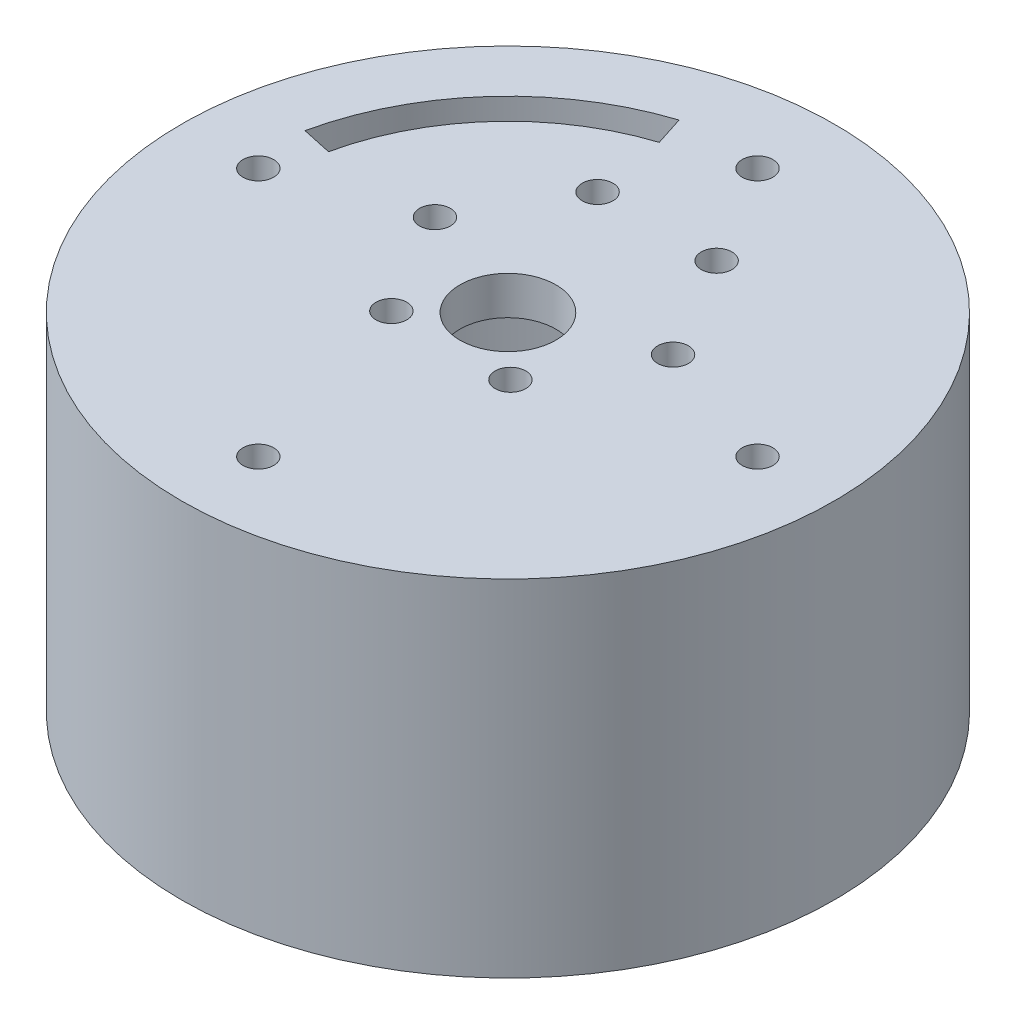
ISO-10303-21;
HEADER;
FILE_DESCRIPTION(('STEP AP214'),'2;1');
FILE_NAME('part.step','',(''),(''),'','','');
FILE_SCHEMA(('AUTOMOTIVE_DESIGN { 1 0 10303 214 1 1 1 1 }'));
ENDSEC;
DATA;
#1=APPLICATION_CONTEXT('core data for automotive mechanical design processes');
#2=APPLICATION_PROTOCOL_DEFINITION('international standard','automotive_design',2000,#1);
#3=PRODUCT_CONTEXT('',#1,'mechanical');
#4=PRODUCT('Part','Part','',(#3));
#5=PRODUCT_RELATED_PRODUCT_CATEGORY('part','',(#4));
#6=PRODUCT_DEFINITION_FORMATION('','',#4);
#7=PRODUCT_DEFINITION_CONTEXT('part definition',#1,'design');
#8=PRODUCT_DEFINITION('design','',#6,#7);
#9=PRODUCT_DEFINITION_SHAPE('','',#8);
#10=(LENGTH_UNIT() NAMED_UNIT(*) SI_UNIT(.MILLI.,.METRE.));
#11=(NAMED_UNIT(*) PLANE_ANGLE_UNIT() SI_UNIT($,.RADIAN.));
#12=(NAMED_UNIT(*) SI_UNIT($,.STERADIAN.) SOLID_ANGLE_UNIT());
#13=UNCERTAINTY_MEASURE_WITH_UNIT(LENGTH_MEASURE(1.E-05),#10,'distance_accuracy_value','');
#14=(GEOMETRIC_REPRESENTATION_CONTEXT(3) GLOBAL_UNCERTAINTY_ASSIGNED_CONTEXT((#13)) GLOBAL_UNIT_ASSIGNED_CONTEXT((#10,
#11,#12)) REPRESENTATION_CONTEXT('',''));
#15=CARTESIAN_POINT('',(0.,0.,0.));
#16=DIRECTION('',(0.,0.,1.));
#17=DIRECTION('',(1.,0.,0.));
#18=AXIS2_PLACEMENT_3D('',#15,#16,#17);
#19=CARTESIAN_POINT('',(0.,0.,0.));
#20=DIRECTION('',(0.,1.,0.));
#21=DIRECTION('',(0.,0.,1.));
#22=AXIS2_PLACEMENT_3D('',#19,#20,#21);
#23=PLANE('',#22);
#24=CARTESIAN_POINT('',(0.,0.,0.));
#25=DIRECTION('',(0.,1.,0.));
#26=DIRECTION('',(0.,0.,1.));
#27=AXIS2_PLACEMENT_3D('',#24,#25,#26);
#28=CIRCLE('',#27,42.5);
#29=CARTESIAN_POINT('',(0.,0.,42.5));
#30=VERTEX_POINT('',#29);
#31=EDGE_CURVE('E11',#30,#30,#28,.T.);
#32=ORIENTED_EDGE('',*,*,#31,.F.);
#33=EDGE_LOOP('',(#32));
#34=FACE_BOUND('',#33,.T.);
#35=CARTESIAN_POINT('',(0.,0.,0.));
#36=DIRECTION('',(0.,1.,0.));
#37=DIRECTION('',(0.,0.,1.));
#38=AXIS2_PLACEMENT_3D('',#35,#36,#37);
#39=CIRCLE('',#38,38.);
#40=CARTESIAN_POINT('',(0.,0.,38.));
#41=VERTEX_POINT('',#40);
#42=EDGE_CURVE('E41',#41,#41,#39,.T.);
#43=ORIENTED_EDGE('',*,*,#42,.T.);
#44=EDGE_LOOP('',(#43));
#45=FACE_BOUND('',#44,.T.);
#46=ADVANCED_FACE('F33',(#34,#45),#23,.F.);
#47=CARTESIAN_POINT('',(0.,40.,0.));
#48=DIRECTION('',(0.,-1.,0.));
#49=DIRECTION('',(0.,0.,-1.));
#50=AXIS2_PLACEMENT_3D('',#47,#48,#49);
#51=CYLINDRICAL_SURFACE('',#50,42.5);
#52=ORIENTED_EDGE('',*,*,#31,.T.);
#53=EDGE_LOOP('',(#52));
#54=FACE_BOUND('',#53,.T.);
#55=CARTESIAN_POINT('',(0.,45.,0.));
#56=DIRECTION('',(0.,1.,0.));
#57=DIRECTION('',(0.,0.,1.));
#58=AXIS2_PLACEMENT_3D('',#55,#56,#57);
#59=CIRCLE('',#58,42.5);
#60=CARTESIAN_POINT('',(0.,45.,42.5));
#61=VERTEX_POINT('',#60);
#62=EDGE_CURVE('E174',#61,#61,#59,.T.);
#63=ORIENTED_EDGE('',*,*,#62,.F.);
#64=EDGE_LOOP('',(#63));
#65=FACE_BOUND('',#64,.T.);
#66=ADVANCED_FACE('F35',(#54,#65),#51,.T.);
#67=CARTESIAN_POINT('',(0.,40.,0.));
#68=DIRECTION('',(0.,-1.,0.));
#69=DIRECTION('',(0.,0.,-1.));
#70=AXIS2_PLACEMENT_3D('',#67,#68,#69);
#71=CYLINDRICAL_SURFACE('',#70,38.);
#72=CARTESIAN_POINT('',(0.,40.,0.));
#73=DIRECTION('',(0.,1.,0.));
#74=DIRECTION('',(0.,0.,1.));
#75=AXIS2_PLACEMENT_3D('',#72,#73,#74);
#76=CIRCLE('',#75,38.);
#77=CARTESIAN_POINT('',(0.,40.,38.));
#78=VERTEX_POINT('',#77);
#79=EDGE_CURVE('E179',#78,#78,#76,.T.);
#80=ORIENTED_EDGE('',*,*,#79,.T.);
#81=EDGE_LOOP('',(#80));
#82=FACE_BOUND('',#81,.T.);
#83=ORIENTED_EDGE('',*,*,#42,.F.);
#84=EDGE_LOOP('',(#83));
#85=FACE_BOUND('',#84,.T.);
#86=ADVANCED_FACE('F185',(#82,#85),#71,.F.);
#87=CARTESIAN_POINT('',(0.,40.,0.));
#88=DIRECTION('',(0.,1.,0.));
#89=DIRECTION('',(0.,0.,1.));
#90=AXIS2_PLACEMENT_3D('',#87,#88,#89);
#91=PLANE('',#90);
#92=DIRECTION('',(-0.306124615795108,0.,-0.951991449333605));
#93=VECTOR('',#92,1.);
#94=CARTESIAN_POINT('',(-10.5612992449312,40.,-32.8437050020094));
#95=LINE('',#94,#93);
#96=CARTESIAN_POINT('',(-9.33680078175078,40.,-29.035739204675));
#97=VERTEX_POINT('',#96);
#98=CARTESIAN_POINT('',(-10.5612992449312,40.,-32.8437050020094));
#99=VERTEX_POINT('',#98);
#100=EDGE_CURVE('E82',#97,#99,#95,.T.);
#101=ORIENTED_EDGE('',*,*,#100,.T.);
#102=CARTESIAN_POINT('',(0.,40.,0.));
#103=DIRECTION('',(0.,1.,0.));
#104=DIRECTION('',(0.,0.,1.));
#105=AXIS2_PLACEMENT_3D('',#102,#103,#104);
#106=CIRCLE('',#105,34.5);
#107=CARTESIAN_POINT('',(-33.7198834104826,40.,-7.29516708399881));
#108=VERTEX_POINT('',#107);
#109=EDGE_CURVE('E76',#99,#108,#106,.T.);
#110=ORIENTED_EDGE('',*,*,#109,.T.);
#111=DIRECTION('',(0.977387924941525,0.,0.211454118376777));
#112=VECTOR('',#111,1.);
#113=CARTESIAN_POINT('',(-33.7198834104826,40.,-7.29516708399881));
#114=LINE('',#113,#112);
#115=CARTESIAN_POINT('',(-29.8103317107165,40.,-6.4493506104917));
#116=VERTEX_POINT('',#115);
#117=EDGE_CURVE('E85',#108,#116,#114,.T.);
#118=ORIENTED_EDGE('',*,*,#117,.T.);
#119=CARTESIAN_POINT('',(0.,40.,0.));
#120=DIRECTION('',(0.,-1.,0.));
#121=DIRECTION('',(0.,0.,1.));
#122=AXIS2_PLACEMENT_3D('',#119,#120,#121);
#123=CIRCLE('',#122,30.5);
#124=EDGE_CURVE('E48',#116,#97,#123,.T.);
#125=ORIENTED_EDGE('',*,*,#124,.T.);
#126=EDGE_LOOP('',(#101,#110,#118,#125));
#127=FACE_BOUND('',#126,.T.);
#128=CARTESIAN_POINT('',(0.,40.,0.));
#129=DIRECTION('',(0.,1.,0.));
#130=DIRECTION('',(0.,0.,1.));
#131=AXIS2_PLACEMENT_3D('',#128,#129,#130);
#132=CIRCLE('',#131,6.25);
#133=CARTESIAN_POINT('',(0.,40.,6.25));
#134=VERTEX_POINT('',#133);
#135=EDGE_CURVE('E171',#134,#134,#132,.T.);
#136=ORIENTED_EDGE('',*,*,#135,.T.);
#137=EDGE_LOOP('',(#136));
#138=FACE_BOUND('',#137,.T.);
#139=CARTESIAN_POINT('',(1.13473143512402E-13,40.,-32.5));
#140=DIRECTION('',(0.,1.,0.));
#141=DIRECTION('',(0.,0.,1.));
#142=AXIS2_PLACEMENT_3D('',#139,#140,#141);
#143=CIRCLE('',#142,2.);
#144=CARTESIAN_POINT('',(1.13473143512402E-13,40.,-30.5));
#145=VERTEX_POINT('',#144);
#146=EDGE_CURVE('E142',#145,#145,#143,.T.);
#147=ORIENTED_EDGE('',*,*,#146,.T.);
#148=EDGE_LOOP('',(#147));
#149=FACE_BOUND('',#148,.T.);
#150=CARTESIAN_POINT('',(-32.5,40.,0.));
#151=DIRECTION('',(0.,1.,0.));
#152=DIRECTION('',(0.,0.,1.));
#153=AXIS2_PLACEMENT_3D('',#150,#151,#152);
#154=CIRCLE('',#153,2.);
#155=CARTESIAN_POINT('',(-32.5,40.,2.));
#156=VERTEX_POINT('',#155);
#157=EDGE_CURVE('E136',#156,#156,#154,.T.);
#158=ORIENTED_EDGE('',*,*,#157,.T.);
#159=EDGE_LOOP('',(#158));
#160=FACE_BOUND('',#159,.T.);
#161=CARTESIAN_POINT('',(-7.75000000000016,40.,7.42339375865871));
#162=DIRECTION('',(0.,1.,0.));
#163=DIRECTION('',(0.,0.,1.));
#164=AXIS2_PLACEMENT_3D('',#161,#162,#163);
#165=CIRCLE('',#164,2.);
#166=CARTESIAN_POINT('',(-7.75000000000016,40.,9.42339375865871));
#167=VERTEX_POINT('',#166);
#168=EDGE_CURVE('E130',#167,#167,#165,.T.);
#169=ORIENTED_EDGE('',*,*,#168,.T.);
#170=EDGE_LOOP('',(#169));
#171=FACE_BOUND('',#170,.T.);
#172=CARTESIAN_POINT('',(7.74999999999988,40.,7.42339375865887));
#173=DIRECTION('',(0.,1.,0.));
#174=DIRECTION('',(0.,0.,1.));
#175=AXIS2_PLACEMENT_3D('',#172,#173,#174);
#176=CIRCLE('',#175,2.);
#177=CARTESIAN_POINT('',(7.74999999999988,40.,9.42339375865887));
#178=VERTEX_POINT('',#177);
#179=EDGE_CURVE('E123',#178,#178,#176,.T.);
#180=ORIENTED_EDGE('',*,*,#179,.T.);
#181=EDGE_LOOP('',(#180));
#182=FACE_BOUND('',#181,.T.);
#183=CARTESIAN_POINT('',(15.5,40.,-5.99999999999989));
#184=DIRECTION('',(0.,1.,0.));
#185=DIRECTION('',(0.,0.,1.));
#186=AXIS2_PLACEMENT_3D('',#183,#184,#185);
#187=CIRCLE('',#186,2.);
#188=CARTESIAN_POINT('',(15.5,40.,-3.99999999999989));
#189=VERTEX_POINT('',#188);
#190=EDGE_CURVE('E166',#189,#189,#187,.T.);
#191=ORIENTED_EDGE('',*,*,#190,.T.);
#192=EDGE_LOOP('',(#191));
#193=FACE_BOUND('',#192,.T.);
#194=CARTESIAN_POINT('',(7.75000000000006,40.,-19.4233937586588));
#195=DIRECTION('',(0.,1.,0.));
#196=DIRECTION('',(0.,0.,1.));
#197=AXIS2_PLACEMENT_3D('',#194,#195,#196);
#198=CIRCLE('',#197,2.);
#199=CARTESIAN_POINT('',(7.75000000000006,40.,-17.4233937586588));
#200=VERTEX_POINT('',#199);
#201=EDGE_CURVE('E160',#200,#200,#198,.T.);
#202=ORIENTED_EDGE('',*,*,#201,.T.);
#203=EDGE_LOOP('',(#202));
#204=FACE_BOUND('',#203,.T.);
#205=CARTESIAN_POINT('',(-7.74999999999997,40.,-19.4233937586588));
#206=DIRECTION('',(0.,1.,0.));
#207=DIRECTION('',(0.,0.,1.));
#208=AXIS2_PLACEMENT_3D('',#205,#206,#207);
#209=CIRCLE('',#208,2.);
#210=CARTESIAN_POINT('',(-7.74999999999997,40.,-17.4233937586588));
#211=VERTEX_POINT('',#210);
#212=EDGE_CURVE('E154',#211,#211,#209,.T.);
#213=ORIENTED_EDGE('',*,*,#212,.T.);
#214=EDGE_LOOP('',(#213));
#215=FACE_BOUND('',#214,.T.);
#216=CARTESIAN_POINT('',(-15.5,40.,-6.));
#217=DIRECTION('',(0.,1.,0.));
#218=DIRECTION('',(0.,0.,1.));
#219=AXIS2_PLACEMENT_3D('',#216,#217,#218);
#220=CIRCLE('',#219,2.);
#221=CARTESIAN_POINT('',(-15.5,40.,-4.));
#222=VERTEX_POINT('',#221);
#223=EDGE_CURVE('E147',#222,#222,#220,.T.);
#224=ORIENTED_EDGE('',*,*,#223,.T.);
#225=EDGE_LOOP('',(#224));
#226=FACE_BOUND('',#225,.T.);
#227=CARTESIAN_POINT('',(32.5,40.,2.26946287024804E-13));
#228=DIRECTION('',(0.,1.,0.));
#229=DIRECTION('',(0.,0.,1.));
#230=AXIS2_PLACEMENT_3D('',#227,#228,#229);
#231=CIRCLE('',#230,2.);
#232=CARTESIAN_POINT('',(32.5,40.,2.00000000000023));
#233=VERTEX_POINT('',#232);
#234=EDGE_CURVE('E111',#233,#233,#231,.T.);
#235=ORIENTED_EDGE('',*,*,#234,.T.);
#236=EDGE_LOOP('',(#235));
#237=FACE_BOUND('',#236,.T.);
#238=CARTESIAN_POINT('',(-3.40419430537206E-13,40.,32.5));
#239=DIRECTION('',(0.,1.,0.));
#240=DIRECTION('',(0.,0.,1.));
#241=AXIS2_PLACEMENT_3D('',#238,#239,#240);
#242=CIRCLE('',#241,2.);
#243=CARTESIAN_POINT('',(-3.40419430537206E-13,40.,34.5));
#244=VERTEX_POINT('',#243);
#245=EDGE_CURVE('E118',#244,#244,#242,.T.);
#246=ORIENTED_EDGE('',*,*,#245,.T.);
#247=EDGE_LOOP('',(#246));
#248=FACE_BOUND('',#247,.T.);
#249=ORIENTED_EDGE('',*,*,#79,.F.);
#250=EDGE_LOOP('',(#249));
#251=FACE_BOUND('',#250,.T.);
#252=ADVANCED_FACE('F89',(#127,#138,#149,#160,#171,#182,#193,#204,#215,#226,#237,#248,#251),#91,.F.);
#253=CARTESIAN_POINT('',(0.,45.,0.));
#254=DIRECTION('',(0.,1.,0.));
#255=DIRECTION('',(0.,0.,1.));
#256=AXIS2_PLACEMENT_3D('',#253,#254,#255);
#257=PLANE('',#256);
#258=CARTESIAN_POINT('',(0.,45.,0.));
#259=DIRECTION('',(0.,1.,0.));
#260=DIRECTION('',(0.,0.,1.));
#261=AXIS2_PLACEMENT_3D('',#258,#259,#260);
#262=CIRCLE('',#261,34.5);
#263=CARTESIAN_POINT('',(-10.5612992449312,45.,-32.8437050020094));
#264=VERTEX_POINT('',#263);
#265=CARTESIAN_POINT('',(-33.7198834104826,45.,-7.29516708399881));
#266=VERTEX_POINT('',#265);
#267=EDGE_CURVE('E56',#264,#266,#262,.T.);
#268=ORIENTED_EDGE('',*,*,#267,.F.);
#269=DIRECTION('',(-0.306124615795108,0.,-0.951991449333605));
#270=VECTOR('',#269,1.);
#271=CARTESIAN_POINT('',(-10.5612992449312,45.,-32.8437050020094));
#272=LINE('',#271,#270);
#273=CARTESIAN_POINT('',(-9.33680078175078,45.,-29.035739204675));
#274=VERTEX_POINT('',#273);
#275=EDGE_CURVE('E92',#274,#264,#272,.T.);
#276=ORIENTED_EDGE('',*,*,#275,.F.);
#277=CARTESIAN_POINT('',(0.,45.,0.));
#278=DIRECTION('',(0.,-1.,0.));
#279=DIRECTION('',(0.,0.,1.));
#280=AXIS2_PLACEMENT_3D('',#277,#278,#279);
#281=CIRCLE('',#280,30.5);
#282=CARTESIAN_POINT('',(-29.8103317107165,45.,-6.4493506104917));
#283=VERTEX_POINT('',#282);
#284=EDGE_CURVE('E95',#283,#274,#281,.T.);
#285=ORIENTED_EDGE('',*,*,#284,.F.);
#286=DIRECTION('',(0.977387924941525,0.,0.211454118376777));
#287=VECTOR('',#286,1.);
#288=CARTESIAN_POINT('',(-33.7198834104826,45.,-7.29516708399881));
#289=LINE('',#288,#287);
#290=EDGE_CURVE('E101',#266,#283,#289,.T.);
#291=ORIENTED_EDGE('',*,*,#290,.F.);
#292=EDGE_LOOP('',(#268,#276,#285,#291));
#293=FACE_BOUND('',#292,.T.);
#294=CARTESIAN_POINT('',(1.13473143512402E-13,45.,-32.5));
#295=DIRECTION('',(0.,1.,0.));
#296=DIRECTION('',(0.,0.,1.));
#297=AXIS2_PLACEMENT_3D('',#294,#295,#296);
#298=CIRCLE('',#297,2.);
#299=CARTESIAN_POINT('',(1.13473143512402E-13,45.,-30.5));
#300=VERTEX_POINT('',#299);
#301=EDGE_CURVE('E114',#300,#300,#298,.T.);
#302=ORIENTED_EDGE('',*,*,#301,.F.);
#303=EDGE_LOOP('',(#302));
#304=FACE_BOUND('',#303,.T.);
#305=CARTESIAN_POINT('',(-32.5,45.,0.));
#306=DIRECTION('',(0.,1.,0.));
#307=DIRECTION('',(0.,0.,1.));
#308=AXIS2_PLACEMENT_3D('',#305,#306,#307);
#309=CIRCLE('',#308,2.);
#310=CARTESIAN_POINT('',(-32.5,45.,2.));
#311=VERTEX_POINT('',#310);
#312=EDGE_CURVE('E139',#311,#311,#309,.T.);
#313=ORIENTED_EDGE('',*,*,#312,.F.);
#314=EDGE_LOOP('',(#313));
#315=FACE_BOUND('',#314,.T.);
#316=CARTESIAN_POINT('',(-7.75000000000016,45.,7.42339375865871));
#317=DIRECTION('',(0.,1.,0.));
#318=DIRECTION('',(0.,0.,1.));
#319=AXIS2_PLACEMENT_3D('',#316,#317,#318);
#320=CIRCLE('',#319,2.);
#321=CARTESIAN_POINT('',(-7.75000000000016,45.,9.42339375865871));
#322=VERTEX_POINT('',#321);
#323=EDGE_CURVE('E133',#322,#322,#320,.T.);
#324=ORIENTED_EDGE('',*,*,#323,.F.);
#325=EDGE_LOOP('',(#324));
#326=FACE_BOUND('',#325,.T.);
#327=CARTESIAN_POINT('',(7.74999999999988,45.,7.42339375865887));
#328=DIRECTION('',(0.,1.,0.));
#329=DIRECTION('',(0.,0.,1.));
#330=AXIS2_PLACEMENT_3D('',#327,#328,#329);
#331=CIRCLE('',#330,2.);
#332=CARTESIAN_POINT('',(7.74999999999988,45.,9.42339375865887));
#333=VERTEX_POINT('',#332);
#334=EDGE_CURVE('E127',#333,#333,#331,.T.);
#335=ORIENTED_EDGE('',*,*,#334,.F.);
#336=EDGE_LOOP('',(#335));
#337=FACE_BOUND('',#336,.T.);
#338=CARTESIAN_POINT('',(15.5,45.,-5.99999999999989));
#339=DIRECTION('',(0.,1.,0.));
#340=DIRECTION('',(0.,0.,1.));
#341=AXIS2_PLACEMENT_3D('',#338,#339,#340);
#342=CIRCLE('',#341,2.);
#343=CARTESIAN_POINT('',(15.5,45.,-3.99999999999989));
#344=VERTEX_POINT('',#343);
#345=EDGE_CURVE('E126',#344,#344,#342,.T.);
#346=ORIENTED_EDGE('',*,*,#345,.F.);
#347=EDGE_LOOP('',(#346));
#348=FACE_BOUND('',#347,.T.);
#349=CARTESIAN_POINT('',(7.75000000000006,45.,-19.4233937586588));
#350=DIRECTION('',(0.,1.,0.));
#351=DIRECTION('',(0.,0.,1.));
#352=AXIS2_PLACEMENT_3D('',#349,#350,#351);
#353=CIRCLE('',#352,2.);
#354=CARTESIAN_POINT('',(7.75000000000006,45.,-17.4233937586588));
#355=VERTEX_POINT('',#354);
#356=EDGE_CURVE('E163',#355,#355,#353,.T.);
#357=ORIENTED_EDGE('',*,*,#356,.F.);
#358=EDGE_LOOP('',(#357));
#359=FACE_BOUND('',#358,.T.);
#360=CARTESIAN_POINT('',(-7.74999999999997,45.,-19.4233937586588));
#361=DIRECTION('',(0.,1.,0.));
#362=DIRECTION('',(0.,0.,1.));
#363=AXIS2_PLACEMENT_3D('',#360,#361,#362);
#364=CIRCLE('',#363,2.);
#365=CARTESIAN_POINT('',(-7.74999999999997,45.,-17.4233937586588));
#366=VERTEX_POINT('',#365);
#367=EDGE_CURVE('E157',#366,#366,#364,.T.);
#368=ORIENTED_EDGE('',*,*,#367,.F.);
#369=EDGE_LOOP('',(#368));
#370=FACE_BOUND('',#369,.T.);
#371=CARTESIAN_POINT('',(-15.5,45.,-6.));
#372=DIRECTION('',(0.,1.,0.));
#373=DIRECTION('',(0.,0.,1.));
#374=AXIS2_PLACEMENT_3D('',#371,#372,#373);
#375=CIRCLE('',#374,2.);
#376=CARTESIAN_POINT('',(-15.5,45.,-4.));
#377=VERTEX_POINT('',#376);
#378=EDGE_CURVE('E151',#377,#377,#375,.T.);
#379=ORIENTED_EDGE('',*,*,#378,.F.);
#380=EDGE_LOOP('',(#379));
#381=FACE_BOUND('',#380,.T.);
#382=CARTESIAN_POINT('',(32.5,45.,2.26946287024804E-13));
#383=DIRECTION('',(0.,1.,0.));
#384=DIRECTION('',(0.,0.,1.));
#385=AXIS2_PLACEMENT_3D('',#382,#383,#384);
#386=CIRCLE('',#385,2.);
#387=CARTESIAN_POINT('',(32.5,45.,2.00000000000023));
#388=VERTEX_POINT('',#387);
#389=EDGE_CURVE('E115',#388,#388,#386,.T.);
#390=ORIENTED_EDGE('',*,*,#389,.F.);
#391=EDGE_LOOP('',(#390));
#392=FACE_BOUND('',#391,.T.);
#393=CARTESIAN_POINT('',(-3.40419430537206E-13,45.,32.5));
#394=DIRECTION('',(0.,1.,0.));
#395=DIRECTION('',(0.,0.,1.));
#396=AXIS2_PLACEMENT_3D('',#393,#394,#395);
#397=CIRCLE('',#396,2.);
#398=CARTESIAN_POINT('',(-3.40419430537206E-13,45.,34.5));
#399=VERTEX_POINT('',#398);
#400=EDGE_CURVE('E107',#399,#399,#397,.T.);
#401=ORIENTED_EDGE('',*,*,#400,.F.);
#402=EDGE_LOOP('',(#401));
#403=FACE_BOUND('',#402,.T.);
#404=CARTESIAN_POINT('',(0.,45.,0.));
#405=DIRECTION('',(0.,1.,0.));
#406=DIRECTION('',(0.,0.,1.));
#407=AXIS2_PLACEMENT_3D('',#404,#405,#406);
#408=CIRCLE('',#407,6.25);
#409=CARTESIAN_POINT('',(0.,45.,6.25));
#410=VERTEX_POINT('',#409);
#411=EDGE_CURVE('E150',#410,#410,#408,.T.);
#412=ORIENTED_EDGE('',*,*,#411,.F.);
#413=EDGE_LOOP('',(#412));
#414=FACE_BOUND('',#413,.T.);
#415=ORIENTED_EDGE('',*,*,#62,.T.);
#416=EDGE_LOOP('',(#415));
#417=FACE_BOUND('',#416,.T.);
#418=ADVANCED_FACE('F193',(#293,#304,#315,#326,#337,#348,#359,#370,#381,#392,#403,#414,#417),
#257,.T.);
#419=CARTESIAN_POINT('',(0.,40.,0.));
#420=DIRECTION('',(0.,1.,0.));
#421=DIRECTION('',(0.,0.,1.));
#422=AXIS2_PLACEMENT_3D('',#419,#420,#421);
#423=CYLINDRICAL_SURFACE('',#422,6.25);
#424=ORIENTED_EDGE('',*,*,#135,.F.);
#425=EDGE_LOOP('',(#424));
#426=FACE_BOUND('',#425,.T.);
#427=ORIENTED_EDGE('',*,*,#411,.T.);
#428=EDGE_LOOP('',(#427));
#429=FACE_BOUND('',#428,.T.);
#430=ADVANCED_FACE('F205',(#426,#429),#423,.F.);
#431=CARTESIAN_POINT('',(-3.40419430537206E-13,40.,32.5));
#432=DIRECTION('',(0.,1.,0.));
#433=DIRECTION('',(0.,0.,1.));
#434=AXIS2_PLACEMENT_3D('',#431,#432,#433);
#435=CYLINDRICAL_SURFACE('',#434,2.);
#436=ORIENTED_EDGE('',*,*,#245,.F.);
#437=EDGE_LOOP('',(#436));
#438=FACE_BOUND('',#437,.T.);
#439=ORIENTED_EDGE('',*,*,#400,.T.);
#440=EDGE_LOOP('',(#439));
#441=FACE_BOUND('',#440,.T.);
#442=ADVANCED_FACE('F211',(#438,#441),#435,.F.);
#443=CARTESIAN_POINT('',(32.5,40.,2.26946287024804E-13));
#444=DIRECTION('',(0.,1.,0.));
#445=DIRECTION('',(0.,0.,1.));
#446=AXIS2_PLACEMENT_3D('',#443,#444,#445);
#447=CYLINDRICAL_SURFACE('',#446,2.);
#448=ORIENTED_EDGE('',*,*,#234,.F.);
#449=EDGE_LOOP('',(#448));
#450=FACE_BOUND('',#449,.T.);
#451=ORIENTED_EDGE('',*,*,#389,.T.);
#452=EDGE_LOOP('',(#451));
#453=FACE_BOUND('',#452,.T.);
#454=ADVANCED_FACE('F232',(#450,#453),#447,.F.);
#455=CARTESIAN_POINT('',(-15.5,40.,-6.));
#456=DIRECTION('',(0.,1.,0.));
#457=DIRECTION('',(0.,0.,1.));
#458=AXIS2_PLACEMENT_3D('',#455,#456,#457);
#459=CYLINDRICAL_SURFACE('',#458,2.);
#460=ORIENTED_EDGE('',*,*,#223,.F.);
#461=EDGE_LOOP('',(#460));
#462=FACE_BOUND('',#461,.T.);
#463=ORIENTED_EDGE('',*,*,#378,.T.);
#464=EDGE_LOOP('',(#463));
#465=FACE_BOUND('',#464,.T.);
#466=ADVANCED_FACE('F228',(#462,#465),#459,.F.);
#467=CARTESIAN_POINT('',(-7.74999999999997,40.,-19.4233937586588));
#468=DIRECTION('',(0.,1.,0.));
#469=DIRECTION('',(0.,0.,1.));
#470=AXIS2_PLACEMENT_3D('',#467,#468,#469);
#471=CYLINDRICAL_SURFACE('',#470,2.);
#472=ORIENTED_EDGE('',*,*,#212,.F.);
#473=EDGE_LOOP('',(#472));
#474=FACE_BOUND('',#473,.T.);
#475=ORIENTED_EDGE('',*,*,#367,.T.);
#476=EDGE_LOOP('',(#475));
#477=FACE_BOUND('',#476,.T.);
#478=ADVANCED_FACE('F224',(#474,#477),#471,.F.);
#479=CARTESIAN_POINT('',(7.75000000000006,40.,-19.4233937586588));
#480=DIRECTION('',(0.,1.,0.));
#481=DIRECTION('',(0.,0.,1.));
#482=AXIS2_PLACEMENT_3D('',#479,#480,#481);
#483=CYLINDRICAL_SURFACE('',#482,2.);
#484=ORIENTED_EDGE('',*,*,#201,.F.);
#485=EDGE_LOOP('',(#484));
#486=FACE_BOUND('',#485,.T.);
#487=ORIENTED_EDGE('',*,*,#356,.T.);
#488=EDGE_LOOP('',(#487));
#489=FACE_BOUND('',#488,.T.);
#490=ADVANCED_FACE('F220',(#486,#489),#483,.F.);
#491=CARTESIAN_POINT('',(15.5,40.,-5.99999999999989));
#492=DIRECTION('',(0.,1.,0.));
#493=DIRECTION('',(0.,0.,1.));
#494=AXIS2_PLACEMENT_3D('',#491,#492,#493);
#495=CYLINDRICAL_SURFACE('',#494,2.);
#496=ORIENTED_EDGE('',*,*,#190,.F.);
#497=EDGE_LOOP('',(#496));
#498=FACE_BOUND('',#497,.T.);
#499=ORIENTED_EDGE('',*,*,#345,.T.);
#500=EDGE_LOOP('',(#499));
#501=FACE_BOUND('',#500,.T.);
#502=ADVANCED_FACE('F216',(#498,#501),#495,.F.);
#503=CARTESIAN_POINT('',(7.74999999999988,40.,7.42339375865887));
#504=DIRECTION('',(0.,1.,0.));
#505=DIRECTION('',(0.,0.,1.));
#506=AXIS2_PLACEMENT_3D('',#503,#504,#505);
#507=CYLINDRICAL_SURFACE('',#506,2.);
#508=ORIENTED_EDGE('',*,*,#179,.F.);
#509=EDGE_LOOP('',(#508));
#510=FACE_BOUND('',#509,.T.);
#511=ORIENTED_EDGE('',*,*,#334,.T.);
#512=EDGE_LOOP('',(#511));
#513=FACE_BOUND('',#512,.T.);
#514=ADVANCED_FACE('F219',(#510,#513),#507,.F.);
#515=CARTESIAN_POINT('',(-7.75000000000016,40.,7.42339375865871));
#516=DIRECTION('',(0.,1.,0.));
#517=DIRECTION('',(0.,0.,1.));
#518=AXIS2_PLACEMENT_3D('',#515,#516,#517);
#519=CYLINDRICAL_SURFACE('',#518,2.);
#520=ORIENTED_EDGE('',*,*,#168,.F.);
#521=EDGE_LOOP('',(#520));
#522=FACE_BOUND('',#521,.T.);
#523=ORIENTED_EDGE('',*,*,#323,.T.);
#524=EDGE_LOOP('',(#523));
#525=FACE_BOUND('',#524,.T.);
#526=ADVANCED_FACE('F241',(#522,#525),#519,.F.);
#527=CARTESIAN_POINT('',(-32.5,40.,0.));
#528=DIRECTION('',(0.,1.,0.));
#529=DIRECTION('',(0.,0.,1.));
#530=AXIS2_PLACEMENT_3D('',#527,#528,#529);
#531=CYLINDRICAL_SURFACE('',#530,2.);
#532=ORIENTED_EDGE('',*,*,#157,.F.);
#533=EDGE_LOOP('',(#532));
#534=FACE_BOUND('',#533,.T.);
#535=ORIENTED_EDGE('',*,*,#312,.T.);
#536=EDGE_LOOP('',(#535));
#537=FACE_BOUND('',#536,.T.);
#538=ADVANCED_FACE('F237',(#534,#537),#531,.F.);
#539=CARTESIAN_POINT('',(1.13473143512402E-13,40.,-32.5));
#540=DIRECTION('',(0.,1.,0.));
#541=DIRECTION('',(0.,0.,1.));
#542=AXIS2_PLACEMENT_3D('',#539,#540,#541);
#543=CYLINDRICAL_SURFACE('',#542,2.);
#544=ORIENTED_EDGE('',*,*,#146,.F.);
#545=EDGE_LOOP('',(#544));
#546=FACE_BOUND('',#545,.T.);
#547=ORIENTED_EDGE('',*,*,#301,.T.);
#548=EDGE_LOOP('',(#547));
#549=FACE_BOUND('',#548,.T.);
#550=ADVANCED_FACE('F234',(#546,#549),#543,.F.);
#551=CARTESIAN_POINT('',(0.,40.,0.));
#552=DIRECTION('',(0.,1.,0.));
#553=DIRECTION('',(0.,0.,1.));
#554=AXIS2_PLACEMENT_3D('',#551,#552,#553);
#555=CYLINDRICAL_SURFACE('',#554,34.5);
#556=ORIENTED_EDGE('',*,*,#267,.T.);
#557=DIRECTION('',(0.,1.,0.));
#558=VECTOR('',#557,1.);
#559=CARTESIAN_POINT('',(-33.7198834104826,40.,-7.29516708399881));
#560=LINE('',#559,#558);
#561=EDGE_CURVE('E72',#108,#266,#560,.T.);
#562=ORIENTED_EDGE('',*,*,#561,.F.);
#563=ORIENTED_EDGE('',*,*,#109,.F.);
#564=DIRECTION('',(0.,1.,0.));
#565=VECTOR('',#564,1.);
#566=CARTESIAN_POINT('',(-10.5612992449312,40.,-32.8437050020094));
#567=LINE('',#566,#565);
#568=EDGE_CURVE('E105',#99,#264,#567,.T.);
#569=ORIENTED_EDGE('',*,*,#568,.T.);
#570=EDGE_LOOP('',(#556,#562,#563,#569));
#571=FACE_BOUND('',#570,.T.);
#572=ADVANCED_FACE('F74',(#571),#555,.F.);
#573=CARTESIAN_POINT('',(-10.5612992449312,40.,-32.8437050020094));
#574=DIRECTION('',(0.951991449333605,0.,-0.306124615795108));
#575=DIRECTION('',(-0.306124615795108,0.,-0.951991449333605));
#576=AXIS2_PLACEMENT_3D('',#573,#574,#575);
#577=PLANE('',#576);
#578=ORIENTED_EDGE('',*,*,#275,.T.);
#579=ORIENTED_EDGE('',*,*,#568,.F.);
#580=ORIENTED_EDGE('',*,*,#100,.F.);
#581=DIRECTION('',(0.,1.,0.));
#582=VECTOR('',#581,1.);
#583=CARTESIAN_POINT('',(-9.33680078175078,40.,-29.035739204675));
#584=LINE('',#583,#582);
#585=EDGE_CURVE('E108',#97,#274,#584,.T.);
#586=ORIENTED_EDGE('',*,*,#585,.T.);
#587=EDGE_LOOP('',(#578,#579,#580,#586));
#588=FACE_BOUND('',#587,.T.);
#589=ADVANCED_FACE('F257',(#588),#577,.F.);
#590=CARTESIAN_POINT('',(0.,40.,0.));
#591=DIRECTION('',(0.,1.,0.));
#592=DIRECTION('',(0.,0.,1.));
#593=AXIS2_PLACEMENT_3D('',#590,#591,#592);
#594=CYLINDRICAL_SURFACE('',#593,30.5);
#595=ORIENTED_EDGE('',*,*,#284,.T.);
#596=ORIENTED_EDGE('',*,*,#585,.F.);
#597=ORIENTED_EDGE('',*,*,#124,.F.);
#598=DIRECTION('',(0.,1.,0.));
#599=VECTOR('',#598,1.);
#600=CARTESIAN_POINT('',(-29.8103317107165,40.,-6.4493506104917));
#601=LINE('',#600,#599);
#602=EDGE_CURVE('E81',#116,#283,#601,.T.);
#603=ORIENTED_EDGE('',*,*,#602,.T.);
#604=EDGE_LOOP('',(#595,#596,#597,#603));
#605=FACE_BOUND('',#604,.T.);
#606=ADVANCED_FACE('F260',(#605),#594,.T.);
#607=CARTESIAN_POINT('',(-33.7198834104826,40.,-7.29516708399881));
#608=DIRECTION('',(-0.211454118376777,0.,0.977387924941525));
#609=DIRECTION('',(0.977387924941525,0.,0.211454118376777));
#610=AXIS2_PLACEMENT_3D('',#607,#608,#609);
#611=PLANE('',#610);
#612=ORIENTED_EDGE('',*,*,#290,.T.);
#613=ORIENTED_EDGE('',*,*,#602,.F.);
#614=ORIENTED_EDGE('',*,*,#117,.F.);
#615=ORIENTED_EDGE('',*,*,#561,.T.);
#616=EDGE_LOOP('',(#612,#613,#614,#615));
#617=FACE_BOUND('',#616,.T.);
#618=ADVANCED_FACE('F86',(#617),#611,.F.);
#619=CLOSED_SHELL('',(#46,#66,#86,#252,#418,#430,#442,#454,#466,#478,#490,#502,#514,#526,#538,
#550,#572,#589,#606,#618));
#620=MANIFOLD_SOLID_BREP('B2',#619);
#621=ADVANCED_BREP_SHAPE_REPRESENTATION('',(#18,#620),#14);
#622=SHAPE_DEFINITION_REPRESENTATION(#9,#621);
ENDSEC;
END-ISO-10303-21;
